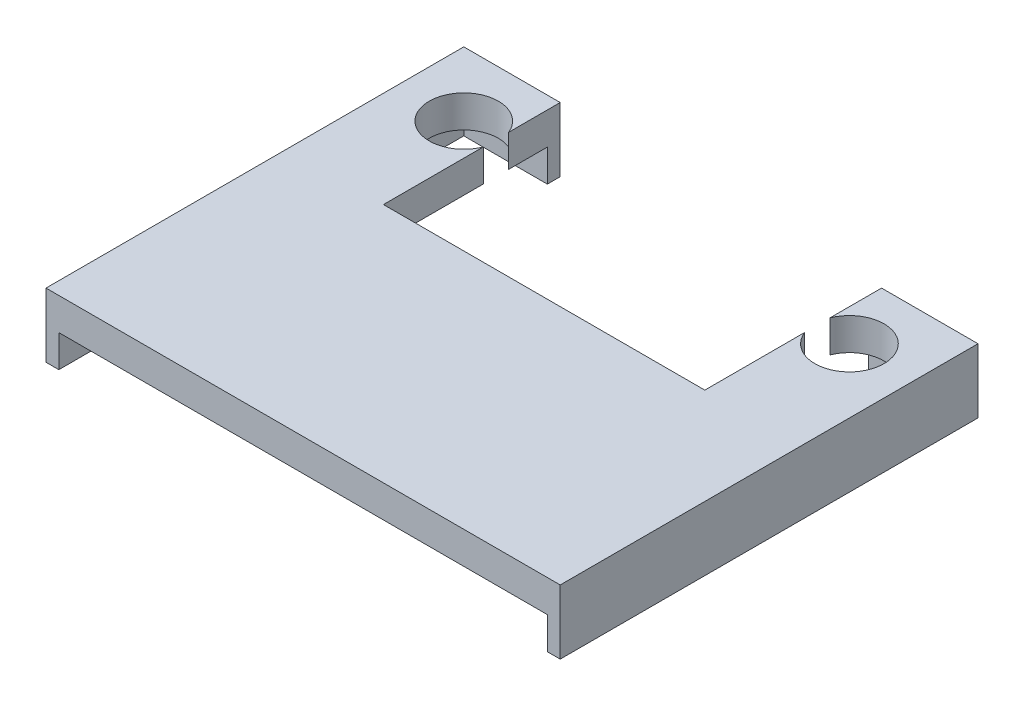
ISO-10303-21;
HEADER;
FILE_DESCRIPTION(('STEP AP214'),'2;1');
FILE_NAME('part.step','',(''),(''),'','','');
FILE_SCHEMA(('AUTOMOTIVE_DESIGN { 1 0 10303 214 1 1 1 1 }'));
ENDSEC;
DATA;
#1=APPLICATION_CONTEXT('core data for automotive mechanical design processes');
#2=APPLICATION_PROTOCOL_DEFINITION('international standard','automotive_design',2000,#1);
#3=PRODUCT_CONTEXT('',#1,'mechanical');
#4=PRODUCT('Part','Part','',(#3));
#5=PRODUCT_RELATED_PRODUCT_CATEGORY('part','',(#4));
#6=PRODUCT_DEFINITION_FORMATION('','',#4);
#7=PRODUCT_DEFINITION_CONTEXT('part definition',#1,'design');
#8=PRODUCT_DEFINITION('design','',#6,#7);
#9=PRODUCT_DEFINITION_SHAPE('','',#8);
#10=(LENGTH_UNIT() NAMED_UNIT(*) SI_UNIT(.MILLI.,.METRE.));
#11=(NAMED_UNIT(*) PLANE_ANGLE_UNIT() SI_UNIT($,.RADIAN.));
#12=(NAMED_UNIT(*) SI_UNIT($,.STERADIAN.) SOLID_ANGLE_UNIT());
#13=UNCERTAINTY_MEASURE_WITH_UNIT(LENGTH_MEASURE(1.E-05),#10,'distance_accuracy_value','');
#14=(GEOMETRIC_REPRESENTATION_CONTEXT(3) GLOBAL_UNCERTAINTY_ASSIGNED_CONTEXT((#13)) GLOBAL_UNIT_ASSIGNED_CONTEXT((#10,
#11,#12)) REPRESENTATION_CONTEXT('',''));
#15=CARTESIAN_POINT('',(0.,0.,0.));
#16=DIRECTION('',(0.,0.,1.));
#17=DIRECTION('',(1.,0.,0.));
#18=AXIS2_PLACEMENT_3D('',#15,#16,#17);
#19=CARTESIAN_POINT('',(0.,6.39522910088368,-0.340843123663283));
#20=DIRECTION('',(0.,1.,0.));
#21=DIRECTION('',(0.,0.,1.));
#22=AXIS2_PLACEMENT_3D('',#19,#20,#21);
#23=PLANE('',#22);
#24=DIRECTION('',(0.,0.,-1.));
#25=VECTOR('',#24,1.);
#26=CARTESIAN_POINT('',(-2.5,6.39522910088368,-2.34084312366329));
#27=LINE('',#26,#25);
#28=CARTESIAN_POINT('',(-2.5,6.39522910088368,-4.14084312366328));
#29=VERTEX_POINT('',#28);
#30=CARTESIAN_POINT('',(-2.5,6.39522910088368,-4.34084312366328));
#31=VERTEX_POINT('',#30);
#32=EDGE_CURVE('E294',#29,#31,#27,.T.);
#33=ORIENTED_EDGE('',*,*,#32,.F.);
#34=DIRECTION('',(1.,0.,0.));
#35=VECTOR('',#34,1.);
#36=CARTESIAN_POINT('',(0.,6.39522910088368,-4.14084312366328));
#37=LINE('',#36,#35);
#38=CARTESIAN_POINT('',(-3.8,6.39522910088368,-4.14084312366328));
#39=VERTEX_POINT('',#38);
#40=EDGE_CURVE('E222',#39,#29,#37,.T.);
#41=ORIENTED_EDGE('',*,*,#40,.F.);
#42=DIRECTION('',(0.,0.,-1.));
#43=VECTOR('',#42,1.);
#44=CARTESIAN_POINT('',(-3.8,6.39522910088368,-0.340843123663283));
#45=LINE('',#44,#43);
#46=CARTESIAN_POINT('',(-3.8,6.39522910088368,2.15915687633672));
#47=VERTEX_POINT('',#46);
#48=EDGE_CURVE('E225',#47,#39,#45,.T.);
#49=ORIENTED_EDGE('',*,*,#48,.F.);
#50=DIRECTION('',(1.,0.,0.));
#51=VECTOR('',#50,1.);
#52=CARTESIAN_POINT('',(0.,6.39522910088368,2.15915687633672));
#53=LINE('',#52,#51);
#54=CARTESIAN_POINT('',(-4.,6.39522910088368,2.15915687633672));
#55=VERTEX_POINT('',#54);
#56=EDGE_CURVE('E282',#55,#47,#53,.T.);
#57=ORIENTED_EDGE('',*,*,#56,.F.);
#58=DIRECTION('',(0.,0.,-1.));
#59=VECTOR('',#58,1.);
#60=CARTESIAN_POINT('',(-4.,6.39522910088368,3.65915687633672));
#61=LINE('',#60,#59);
#62=CARTESIAN_POINT('',(-4.,6.39522910088368,-4.34084312366328));
#63=VERTEX_POINT('',#62);
#64=EDGE_CURVE('E362',#55,#63,#61,.T.);
#65=ORIENTED_EDGE('',*,*,#64,.T.);
#66=DIRECTION('',(1.,0.,0.));
#67=VECTOR('',#66,1.);
#68=CARTESIAN_POINT('',(-4.,6.39522910088368,-4.34084312366328));
#69=LINE('',#68,#67);
#70=EDGE_CURVE('E373',#63,#31,#69,.T.);
#71=ORIENTED_EDGE('',*,*,#70,.T.);
#72=EDGE_LOOP('',(#33,#41,#49,#57,#65,#71));
#73=FACE_BOUND('',#72,.T.);
#74=ADVANCED_FACE('F73',(#73),#23,.F.);
#75=CARTESIAN_POINT('',(-2.5,7.79522910088368,-0.340843123663283));
#76=DIRECTION('',(1.,0.,0.));
#77=DIRECTION('',(0.,0.,-1.));
#78=AXIS2_PLACEMENT_3D('',#75,#76,#77);
#79=PLANE('',#78);
#80=DIRECTION('',(0.,-1.,0.));
#81=VECTOR('',#80,1.);
#82=CARTESIAN_POINT('',(-2.5,7.79522910088368,-1.59084312366329));
#83=LINE('',#82,#81);
#84=CARTESIAN_POINT('',(-2.5,7.39522910088368,-1.59084312366329));
#85=VERTEX_POINT('',#84);
#86=CARTESIAN_POINT('',(-2.5,6.89522910088368,-1.59084312366329));
#87=VERTEX_POINT('',#86);
#88=EDGE_CURVE('E299',#85,#87,#83,.T.);
#89=ORIENTED_EDGE('',*,*,#88,.T.);
#90=DIRECTION('',(0.,0.,1.));
#91=VECTOR('',#90,1.);
#92=CARTESIAN_POINT('',(-2.5,6.89522910088368,-0.340843123663283));
#93=LINE('',#92,#91);
#94=CARTESIAN_POINT('',(-2.5,6.89522910088368,-3.14369754251741));
#95=VERTEX_POINT('',#94);
#96=EDGE_CURVE('E244',#95,#87,#93,.T.);
#97=ORIENTED_EDGE('',*,*,#96,.F.);
#98=DIRECTION('',(0.,-1.,0.));
#99=VECTOR('',#98,1.);
#100=CARTESIAN_POINT('',(-2.5,7.79522910088368,-3.14369754251741));
#101=LINE('',#100,#99);
#102=CARTESIAN_POINT('',(-2.5,7.39522910088368,-3.14369754251741));
#103=VERTEX_POINT('',#102);
#104=EDGE_CURVE('E315',#103,#95,#101,.T.);
#105=ORIENTED_EDGE('',*,*,#104,.F.);
#106=DIRECTION('',(0.,0.,-1.));
#107=VECTOR('',#106,1.);
#108=CARTESIAN_POINT('',(-2.5,7.39522910088368,-0.340843123663283));
#109=LINE('',#108,#107);
#110=EDGE_CURVE('E353',#85,#103,#109,.T.);
#111=ORIENTED_EDGE('',*,*,#110,.F.);
#112=EDGE_LOOP('',(#89,#97,#105,#111));
#113=FACE_BOUND('',#112,.T.);
#114=ADVANCED_FACE('F412',(#113),#79,.T.);
#115=CARTESIAN_POINT('',(0.,7.79522910088368,-1.59084312366329));
#116=DIRECTION('',(0.,0.,-1.));
#117=DIRECTION('',(-1.,0.,0.));
#118=AXIS2_PLACEMENT_3D('',#115,#116,#117);
#119=PLANE('',#118);
#120=DIRECTION('',(0.,-1.,0.));
#121=VECTOR('',#120,1.);
#122=CARTESIAN_POINT('',(2.5,7.79522910088368,-1.59084312366329));
#123=LINE('',#122,#121);
#124=CARTESIAN_POINT('',(2.5,7.39522910088368,-1.59084312366329));
#125=VERTEX_POINT('',#124);
#126=CARTESIAN_POINT('',(2.5,6.89522910088368,-1.59084312366329));
#127=VERTEX_POINT('',#126);
#128=EDGE_CURVE('E295',#125,#127,#123,.T.);
#129=ORIENTED_EDGE('',*,*,#128,.T.);
#130=DIRECTION('',(1.,0.,0.));
#131=VECTOR('',#130,1.);
#132=CARTESIAN_POINT('',(0.,6.89522910088368,-1.59084312366329));
#133=LINE('',#132,#131);
#134=EDGE_CURVE('E247',#87,#127,#133,.T.);
#135=ORIENTED_EDGE('',*,*,#134,.F.);
#136=ORIENTED_EDGE('',*,*,#88,.F.);
#137=DIRECTION('',(-1.,0.,0.));
#138=VECTOR('',#137,1.);
#139=CARTESIAN_POINT('',(0.,7.39522910088368,-1.59084312366329));
#140=LINE('',#139,#138);
#141=EDGE_CURVE('E349',#125,#85,#140,.T.);
#142=ORIENTED_EDGE('',*,*,#141,.F.);
#143=EDGE_LOOP('',(#129,#135,#136,#142));
#144=FACE_BOUND('',#143,.T.);
#145=ADVANCED_FACE('F415',(#144),#119,.T.);
#146=CARTESIAN_POINT('',(2.5,7.79522910088368,-0.340843123663283));
#147=DIRECTION('',(1.,0.,0.));
#148=DIRECTION('',(0.,0.,-1.));
#149=AXIS2_PLACEMENT_3D('',#146,#147,#148);
#150=PLANE('',#149);
#151=DIRECTION('',(0.,0.,-1.));
#152=VECTOR('',#151,1.);
#153=CARTESIAN_POINT('',(2.5,6.89522910088368,-0.340843123663283));
#154=LINE('',#153,#152);
#155=CARTESIAN_POINT('',(2.5,6.89522910088368,-3.14369754251741));
#156=VERTEX_POINT('',#155);
#157=EDGE_CURVE('E250',#127,#156,#154,.T.);
#158=ORIENTED_EDGE('',*,*,#157,.F.);
#159=ORIENTED_EDGE('',*,*,#128,.F.);
#160=DIRECTION('',(0.,0.,-1.));
#161=VECTOR('',#160,1.);
#162=CARTESIAN_POINT('',(2.5,7.39522910088368,-0.340843123663283));
#163=LINE('',#162,#161);
#164=CARTESIAN_POINT('',(2.5,7.39522910088368,-3.14369754251741));
#165=VERTEX_POINT('',#164);
#166=EDGE_CURVE('E346',#125,#165,#163,.T.);
#167=ORIENTED_EDGE('',*,*,#166,.T.);
#168=DIRECTION('',(0.,-1.,0.));
#169=VECTOR('',#168,1.);
#170=CARTESIAN_POINT('',(2.5,7.79522910088368,-3.14369754251741));
#171=LINE('',#170,#169);
#172=EDGE_CURVE('E325',#165,#156,#171,.T.);
#173=ORIENTED_EDGE('',*,*,#172,.T.);
#174=EDGE_LOOP('',(#158,#159,#167,#173));
#175=FACE_BOUND('',#174,.T.);
#176=ADVANCED_FACE('F425',(#175),#150,.F.);
#177=CARTESIAN_POINT('',(-3.,7.79522910088368,-3.34084312366328));
#178=DIRECTION('',(0.,-1.,0.));
#179=DIRECTION('',(0.,0.,-1.));
#180=AXIS2_PLACEMENT_3D('',#177,#178,#179);
#181=CYLINDRICAL_SURFACE('',#180,0.537462910502059);
#182=ORIENTED_EDGE('',*,*,#104,.T.);
#183=CARTESIAN_POINT('',(-3.,6.89522910088368,-3.34084312366328));
#184=DIRECTION('',(0.,-1.,0.));
#185=DIRECTION('',(0.,0.,-1.));
#186=AXIS2_PLACEMENT_3D('',#183,#184,#185);
#187=CIRCLE('',#186,0.537462910502059);
#188=CARTESIAN_POINT('',(-2.5,6.89522910088368,-3.53798870480916));
#189=VERTEX_POINT('',#188);
#190=EDGE_CURVE('E241',#189,#95,#187,.F.);
#191=ORIENTED_EDGE('',*,*,#190,.F.);
#192=DIRECTION('',(0.,-1.,0.));
#193=VECTOR('',#192,1.);
#194=CARTESIAN_POINT('',(-2.5,7.79522910088368,-3.53798870480916));
#195=LINE('',#194,#193);
#196=CARTESIAN_POINT('',(-2.5,7.39522910088368,-3.53798870480916));
#197=VERTEX_POINT('',#196);
#198=EDGE_CURVE('E322',#189,#197,#195,.F.);
#199=ORIENTED_EDGE('',*,*,#198,.T.);
#200=CARTESIAN_POINT('',(-3.,7.39522910088368,-3.34084312366328));
#201=DIRECTION('',(0.,1.,0.));
#202=DIRECTION('',(0.,0.,1.));
#203=AXIS2_PLACEMENT_3D('',#200,#201,#202);
#204=CIRCLE('',#203,0.537462910502059);
#205=EDGE_CURVE('E342',#103,#197,#204,.F.);
#206=ORIENTED_EDGE('',*,*,#205,.F.);
#207=EDGE_LOOP('',(#182,#191,#199,#206));
#208=FACE_BOUND('',#207,.T.);
#209=ADVANCED_FACE('F407',(#208),#181,.F.);
#210=CARTESIAN_POINT('',(3.00000000000001,7.79522910088368,-3.34084312366328));
#211=DIRECTION('',(0.,-1.,0.));
#212=DIRECTION('',(0.,0.,-1.));
#213=AXIS2_PLACEMENT_3D('',#210,#211,#212);
#214=CYLINDRICAL_SURFACE('',#213,0.537462910502059);
#215=CARTESIAN_POINT('',(3.00000000000001,6.89522910088368,-3.34084312366328));
#216=DIRECTION('',(0.,-1.,0.));
#217=DIRECTION('',(0.,0.,-1.));
#218=AXIS2_PLACEMENT_3D('',#215,#216,#217);
#219=CIRCLE('',#218,0.537462910502059);
#220=CARTESIAN_POINT('',(2.5,6.89522910088368,-3.53798870480916));
#221=VERTEX_POINT('',#220);
#222=EDGE_CURVE('E253',#156,#221,#219,.F.);
#223=ORIENTED_EDGE('',*,*,#222,.F.);
#224=ORIENTED_EDGE('',*,*,#172,.F.);
#225=CARTESIAN_POINT('',(3.00000000000001,7.39522910088368,-3.34084312366328));
#226=DIRECTION('',(0.,1.,0.));
#227=DIRECTION('',(0.,0.,1.));
#228=AXIS2_PLACEMENT_3D('',#225,#226,#227);
#229=CIRCLE('',#228,0.537462910502059);
#230=CARTESIAN_POINT('',(2.5,7.39522910088368,-3.53798870480916));
#231=VERTEX_POINT('',#230);
#232=EDGE_CURVE('E304',#165,#231,#229,.T.);
#233=ORIENTED_EDGE('',*,*,#232,.T.);
#234=DIRECTION('',(0.,-1.,0.));
#235=VECTOR('',#234,1.);
#236=CARTESIAN_POINT('',(2.5,7.79522910088368,-3.53798870480916));
#237=LINE('',#236,#235);
#238=EDGE_CURVE('E300',#221,#231,#237,.F.);
#239=ORIENTED_EDGE('',*,*,#238,.F.);
#240=EDGE_LOOP('',(#223,#224,#233,#239));
#241=FACE_BOUND('',#240,.T.);
#242=ADVANCED_FACE('F428',(#241),#214,.F.);
#243=CARTESIAN_POINT('',(-4.,7.39522910088368,-4.34084312366328));
#244=DIRECTION('',(0.,0.,-1.));
#245=DIRECTION('',(-1.,0.,0.));
#246=AXIS2_PLACEMENT_3D('',#243,#244,#245);
#247=PLANE('',#246);
#248=CARTESIAN_POINT('',(2.5,6.39522910088368,-4.34084312366328));
#249=VERTEX_POINT('',#248);
#250=CARTESIAN_POINT('',(4.00000000000001,6.39522910088368,-4.34084312366328));
#251=VERTEX_POINT('',#250);
#252=EDGE_CURVE('E372',#249,#251,#69,.T.);
#253=ORIENTED_EDGE('',*,*,#252,.F.);
#254=DIRECTION('',(0.,-1.,0.));
#255=VECTOR('',#254,1.);
#256=CARTESIAN_POINT('',(2.5,7.79522910088368,-4.34084312366328));
#257=LINE('',#256,#255);
#258=CARTESIAN_POINT('',(2.5,7.39522910088368,-4.34084312366328));
#259=VERTEX_POINT('',#258);
#260=EDGE_CURVE('E311',#259,#249,#257,.T.);
#261=ORIENTED_EDGE('',*,*,#260,.F.);
#262=DIRECTION('',(1.,0.,0.));
#263=VECTOR('',#262,1.);
#264=CARTESIAN_POINT('',(-4.,7.39522910088368,-4.34084312366328));
#265=LINE('',#264,#263);
#266=CARTESIAN_POINT('',(4.00000000000001,7.39522910088368,-4.34084312366328));
#267=VERTEX_POINT('',#266);
#268=EDGE_CURVE('E361',#259,#267,#265,.T.);
#269=ORIENTED_EDGE('',*,*,#268,.T.);
#270=DIRECTION('',(0.,-1.,0.));
#271=VECTOR('',#270,1.);
#272=CARTESIAN_POINT('',(4.00000000000001,7.39522910088368,-4.34084312366328));
#273=LINE('',#272,#271);
#274=EDGE_CURVE('E12',#267,#251,#273,.T.);
#275=ORIENTED_EDGE('',*,*,#274,.T.);
#276=EDGE_LOOP('',(#253,#261,#269,#275));
#277=FACE_BOUND('',#276,.T.);
#278=ADVANCED_FACE('F447',(#277),#247,.T.);
#279=CARTESIAN_POINT('',(4.00000000000001,7.39522910088368,3.65915687633672));
#280=DIRECTION('',(-1.,0.,0.));
#281=DIRECTION('',(0.,0.,1.));
#282=AXIS2_PLACEMENT_3D('',#279,#280,#281);
#283=PLANE('',#282);
#284=DIRECTION('',(0.,0.,-1.));
#285=VECTOR('',#284,1.);
#286=CARTESIAN_POINT('',(4.00000000000001,7.39522910088368,3.65915687633672));
#287=LINE('',#286,#285);
#288=CARTESIAN_POINT('',(4.00000000000001,7.39522910088368,2.15915687633672));
#289=VERTEX_POINT('',#288);
#290=EDGE_CURVE('E358',#289,#267,#287,.T.);
#291=ORIENTED_EDGE('',*,*,#290,.F.);
#292=DIRECTION('',(0.,-1.,0.));
#293=VECTOR('',#292,1.);
#294=CARTESIAN_POINT('',(4.00000000000001,7.79522910088368,2.15915687633672));
#295=LINE('',#294,#293);
#296=CARTESIAN_POINT('',(4.00000000000001,6.39522910088368,2.15915687633672));
#297=VERTEX_POINT('',#296);
#298=EDGE_CURVE('E285',#289,#297,#295,.T.);
#299=ORIENTED_EDGE('',*,*,#298,.T.);
#300=DIRECTION('',(0.,0.,-1.));
#301=VECTOR('',#300,1.);
#302=CARTESIAN_POINT('',(4.00000000000001,6.39522910088368,3.65915687633672));
#303=LINE('',#302,#301);
#304=EDGE_CURVE('E357',#297,#251,#303,.T.);
#305=ORIENTED_EDGE('',*,*,#304,.T.);
#306=ORIENTED_EDGE('',*,*,#274,.F.);
#307=EDGE_LOOP('',(#291,#299,#305,#306));
#308=FACE_BOUND('',#307,.T.);
#309=ADVANCED_FACE('F75',(#308),#283,.F.);
#310=DIRECTION('',(0.,-1.,0.));
#311=VECTOR('',#310,1.);
#312=CARTESIAN_POINT('',(-2.5,7.79522910088368,-4.34084312366328));
#313=LINE('',#312,#311);
#314=CARTESIAN_POINT('',(-2.5,7.39522910088368,-4.34084312366328));
#315=VERTEX_POINT('',#314);
#316=EDGE_CURVE('E310',#315,#31,#313,.T.);
#317=ORIENTED_EDGE('',*,*,#316,.T.);
#318=ORIENTED_EDGE('',*,*,#70,.F.);
#319=DIRECTION('',(0.,-1.,0.));
#320=VECTOR('',#319,1.);
#321=CARTESIAN_POINT('',(-4.,7.39522910088368,-4.34084312366328));
#322=LINE('',#321,#320);
#323=CARTESIAN_POINT('',(-4.,7.39522910088368,-4.34084312366328));
#324=VERTEX_POINT('',#323);
#325=EDGE_CURVE('E82',#324,#63,#322,.T.);
#326=ORIENTED_EDGE('',*,*,#325,.F.);
#327=EDGE_CURVE('E363',#324,#315,#265,.T.);
#328=ORIENTED_EDGE('',*,*,#327,.T.);
#329=EDGE_LOOP('',(#317,#318,#326,#328));
#330=FACE_BOUND('',#329,.T.);
#331=ADVANCED_FACE('F388',(#330),#247,.T.);
#332=CARTESIAN_POINT('',(-4.,7.39522910088368,3.65915687633672));
#333=DIRECTION('',(-1.,0.,0.));
#334=DIRECTION('',(0.,0.,1.));
#335=AXIS2_PLACEMENT_3D('',#332,#333,#334);
#336=PLANE('',#335);
#337=DIRECTION('',(0.,-1.,0.));
#338=VECTOR('',#337,1.);
#339=CARTESIAN_POINT('',(-4.,7.79522910088368,2.15915687633672));
#340=LINE('',#339,#338);
#341=CARTESIAN_POINT('',(-4.,7.39522910088368,2.15915687633672));
#342=VERTEX_POINT('',#341);
#343=EDGE_CURVE('E97',#342,#55,#340,.T.);
#344=ORIENTED_EDGE('',*,*,#343,.F.);
#345=DIRECTION('',(0.,0.,-1.));
#346=VECTOR('',#345,1.);
#347=CARTESIAN_POINT('',(-4.,7.39522910088368,3.65915687633672));
#348=LINE('',#347,#346);
#349=EDGE_CURVE('E367',#342,#324,#348,.T.);
#350=ORIENTED_EDGE('',*,*,#349,.T.);
#351=ORIENTED_EDGE('',*,*,#325,.T.);
#352=ORIENTED_EDGE('',*,*,#64,.F.);
#353=EDGE_LOOP('',(#344,#350,#351,#352));
#354=FACE_BOUND('',#353,.T.);
#355=ADVANCED_FACE('F384',(#354),#336,.T.);
#356=CARTESIAN_POINT('',(0.,7.39522910088368,-0.340843123663283));
#357=DIRECTION('',(0.,1.,0.));
#358=DIRECTION('',(0.,0.,1.));
#359=AXIS2_PLACEMENT_3D('',#356,#357,#358);
#360=PLANE('',#359);
#361=DIRECTION('',(-1.,0.,0.));
#362=VECTOR('',#361,1.);
#363=CARTESIAN_POINT('',(0.,7.39522910088368,2.15915687633672));
#364=LINE('',#363,#362);
#365=EDGE_CURVE('E289',#289,#342,#364,.T.);
#366=ORIENTED_EDGE('',*,*,#365,.F.);
#367=ORIENTED_EDGE('',*,*,#290,.T.);
#368=ORIENTED_EDGE('',*,*,#268,.F.);
#369=DIRECTION('',(0.,0.,1.));
#370=VECTOR('',#369,1.);
#371=CARTESIAN_POINT('',(2.5,7.39522910088368,-0.340843123663283));
#372=LINE('',#371,#370);
#373=EDGE_CURVE('E334',#259,#231,#372,.T.);
#374=ORIENTED_EDGE('',*,*,#373,.T.);
#375=ORIENTED_EDGE('',*,*,#232,.F.);
#376=ORIENTED_EDGE('',*,*,#166,.F.);
#377=ORIENTED_EDGE('',*,*,#141,.T.);
#378=ORIENTED_EDGE('',*,*,#110,.T.);
#379=ORIENTED_EDGE('',*,*,#205,.T.);
#380=DIRECTION('',(0.,0.,1.));
#381=VECTOR('',#380,1.);
#382=CARTESIAN_POINT('',(-2.5,7.39522910088368,-0.340843123663283));
#383=LINE('',#382,#381);
#384=EDGE_CURVE('E338',#315,#197,#383,.T.);
#385=ORIENTED_EDGE('',*,*,#384,.F.);
#386=ORIENTED_EDGE('',*,*,#327,.F.);
#387=ORIENTED_EDGE('',*,*,#349,.F.);
#388=EDGE_LOOP('',(#366,#367,#368,#374,#375,#376,#377,#378,#379,#385,#386,#387));
#389=FACE_BOUND('',#388,.T.);
#390=ADVANCED_FACE('F420',(#389),#360,.T.);
#391=DIRECTION('',(0.,0.,1.));
#392=VECTOR('',#391,1.);
#393=CARTESIAN_POINT('',(3.8,6.39522910088368,-0.340843123663283));
#394=LINE('',#393,#392);
#395=CARTESIAN_POINT('',(3.8,6.39522910088368,-4.14084312366328));
#396=VERTEX_POINT('',#395);
#397=CARTESIAN_POINT('',(3.8,6.39522910088368,2.15915687633672));
#398=VERTEX_POINT('',#397);
#399=EDGE_CURVE('E260',#396,#398,#394,.T.);
#400=ORIENTED_EDGE('',*,*,#399,.F.);
#401=DIRECTION('',(1.,0.,0.));
#402=VECTOR('',#401,1.);
#403=CARTESIAN_POINT('',(0.,6.39522910088368,-4.14084312366328));
#404=LINE('',#403,#402);
#405=CARTESIAN_POINT('',(2.5,6.39522910088368,-4.14084312366328));
#406=VERTEX_POINT('',#405);
#407=EDGE_CURVE('E205',#406,#396,#404,.T.);
#408=ORIENTED_EDGE('',*,*,#407,.F.);
#409=DIRECTION('',(0.,0.,-1.));
#410=VECTOR('',#409,1.);
#411=CARTESIAN_POINT('',(2.5,6.39522910088368,-2.34084312366329));
#412=LINE('',#411,#410);
#413=EDGE_CURVE('E307',#406,#249,#412,.T.);
#414=ORIENTED_EDGE('',*,*,#413,.T.);
#415=ORIENTED_EDGE('',*,*,#252,.T.);
#416=ORIENTED_EDGE('',*,*,#304,.F.);
#417=EDGE_CURVE('E269',#398,#297,#53,.T.);
#418=ORIENTED_EDGE('',*,*,#417,.F.);
#419=EDGE_LOOP('',(#400,#408,#414,#415,#416,#418));
#420=FACE_BOUND('',#419,.T.);
#421=ADVANCED_FACE('F434',(#420),#23,.F.);
#422=CARTESIAN_POINT('',(-2.5,7.79522910088368,-2.34084312366329));
#423=DIRECTION('',(-1.,0.,0.));
#424=DIRECTION('',(0.,0.,1.));
#425=AXIS2_PLACEMENT_3D('',#422,#423,#424);
#426=PLANE('',#425);
#427=DIRECTION('',(0.,0.,1.));
#428=VECTOR('',#427,1.);
#429=CARTESIAN_POINT('',(-2.5,6.89522910088368,-0.340843123663283));
#430=LINE('',#429,#428);
#431=CARTESIAN_POINT('',(-2.5,6.89522910088368,-4.14084312366328));
#432=VERTEX_POINT('',#431);
#433=EDGE_CURVE('E238',#432,#189,#430,.T.);
#434=ORIENTED_EDGE('',*,*,#433,.F.);
#435=DIRECTION('',(0.,-1.,0.));
#436=VECTOR('',#435,1.);
#437=CARTESIAN_POINT('',(-2.5,6.89522910088368,-4.14084312366328));
#438=LINE('',#437,#436);
#439=EDGE_CURVE('E270',#432,#29,#438,.T.);
#440=ORIENTED_EDGE('',*,*,#439,.T.);
#441=ORIENTED_EDGE('',*,*,#32,.T.);
#442=ORIENTED_EDGE('',*,*,#316,.F.);
#443=ORIENTED_EDGE('',*,*,#384,.T.);
#444=ORIENTED_EDGE('',*,*,#198,.F.);
#445=EDGE_LOOP('',(#434,#440,#441,#442,#443,#444));
#446=FACE_BOUND('',#445,.T.);
#447=ADVANCED_FACE('F404',(#446),#426,.F.);
#448=CARTESIAN_POINT('',(2.5,7.79522910088368,-2.34084312366329));
#449=DIRECTION('',(-1.,0.,0.));
#450=DIRECTION('',(0.,0.,1.));
#451=AXIS2_PLACEMENT_3D('',#448,#449,#450);
#452=PLANE('',#451);
#453=DIRECTION('',(0.,-1.,0.));
#454=VECTOR('',#453,1.);
#455=CARTESIAN_POINT('',(2.5,6.89522910088368,-4.14084312366328));
#456=LINE('',#455,#454);
#457=CARTESIAN_POINT('',(2.5,6.89522910088368,-4.14084312366328));
#458=VERTEX_POINT('',#457);
#459=EDGE_CURVE('E266',#458,#406,#456,.T.);
#460=ORIENTED_EDGE('',*,*,#459,.F.);
#461=DIRECTION('',(0.,0.,-1.));
#462=VECTOR('',#461,1.);
#463=CARTESIAN_POINT('',(2.5,6.89522910088368,-0.340843123663283));
#464=LINE('',#463,#462);
#465=EDGE_CURVE('E210',#221,#458,#464,.T.);
#466=ORIENTED_EDGE('',*,*,#465,.F.);
#467=ORIENTED_EDGE('',*,*,#238,.T.);
#468=ORIENTED_EDGE('',*,*,#373,.F.);
#469=ORIENTED_EDGE('',*,*,#260,.T.);
#470=ORIENTED_EDGE('',*,*,#413,.F.);
#471=EDGE_LOOP('',(#460,#466,#467,#468,#469,#470));
#472=FACE_BOUND('',#471,.T.);
#473=ADVANCED_FACE('F431',(#472),#452,.T.);
#474=CARTESIAN_POINT('',(0.,7.79522910088368,2.15915687633672));
#475=DIRECTION('',(0.,0.,-1.));
#476=DIRECTION('',(-1.,0.,0.));
#477=AXIS2_PLACEMENT_3D('',#474,#475,#476);
#478=PLANE('',#477);
#479=ORIENTED_EDGE('',*,*,#56,.T.);
#480=DIRECTION('',(0.,-1.,0.));
#481=VECTOR('',#480,1.);
#482=CARTESIAN_POINT('',(-3.8,6.89522910088368,2.15915687633672));
#483=LINE('',#482,#481);
#484=CARTESIAN_POINT('',(-3.8,6.89522910088368,2.15915687633672));
#485=VERTEX_POINT('',#484);
#486=EDGE_CURVE('E277',#485,#47,#483,.T.);
#487=ORIENTED_EDGE('',*,*,#486,.F.);
#488=DIRECTION('',(1.,0.,0.));
#489=VECTOR('',#488,1.);
#490=CARTESIAN_POINT('',(0.,6.89522910088368,2.15915687633672));
#491=LINE('',#490,#489);
#492=CARTESIAN_POINT('',(3.8,6.89522910088368,2.15915687633672));
#493=VERTEX_POINT('',#492);
#494=EDGE_CURVE('E216',#485,#493,#491,.T.);
#495=ORIENTED_EDGE('',*,*,#494,.T.);
#496=DIRECTION('',(0.,-1.,0.));
#497=VECTOR('',#496,1.);
#498=CARTESIAN_POINT('',(3.8,6.89522910088368,2.15915687633672));
#499=LINE('',#498,#497);
#500=EDGE_CURVE('E209',#493,#398,#499,.T.);
#501=ORIENTED_EDGE('',*,*,#500,.T.);
#502=ORIENTED_EDGE('',*,*,#417,.T.);
#503=ORIENTED_EDGE('',*,*,#298,.F.);
#504=ORIENTED_EDGE('',*,*,#365,.T.);
#505=ORIENTED_EDGE('',*,*,#343,.T.);
#506=EDGE_LOOP('',(#479,#487,#495,#501,#502,#503,#504,#505));
#507=FACE_BOUND('',#506,.T.);
#508=ADVANCED_FACE('F394',(#507),#478,.F.);
#509=CARTESIAN_POINT('',(0.,6.89522910088368,-4.14084312366328));
#510=DIRECTION('',(0.,0.,-1.));
#511=DIRECTION('',(-1.,0.,0.));
#512=AXIS2_PLACEMENT_3D('',#509,#510,#511);
#513=PLANE('',#512);
#514=ORIENTED_EDGE('',*,*,#407,.T.);
#515=DIRECTION('',(0.,-1.,0.));
#516=VECTOR('',#515,1.);
#517=CARTESIAN_POINT('',(3.8,6.89522910088368,-4.14084312366328));
#518=LINE('',#517,#516);
#519=CARTESIAN_POINT('',(3.8,6.89522910088368,-4.14084312366328));
#520=VERTEX_POINT('',#519);
#521=EDGE_CURVE('E200',#520,#396,#518,.T.);
#522=ORIENTED_EDGE('',*,*,#521,.F.);
#523=DIRECTION('',(1.,0.,0.));
#524=VECTOR('',#523,1.);
#525=CARTESIAN_POINT('',(0.,6.89522910088368,-4.14084312366328));
#526=LINE('',#525,#524);
#527=EDGE_CURVE('E202',#458,#520,#526,.T.);
#528=ORIENTED_EDGE('',*,*,#527,.F.);
#529=ORIENTED_EDGE('',*,*,#459,.T.);
#530=EDGE_LOOP('',(#514,#522,#528,#529));
#531=FACE_BOUND('',#530,.T.);
#532=ADVANCED_FACE('F201',(#531),#513,.F.);
#533=CARTESIAN_POINT('',(0.,6.89522910088368,-4.14084312366328));
#534=DIRECTION('',(0.,0.,-1.));
#535=DIRECTION('',(-1.,0.,0.));
#536=AXIS2_PLACEMENT_3D('',#533,#534,#535);
#537=PLANE('',#536);
#538=ORIENTED_EDGE('',*,*,#40,.T.);
#539=ORIENTED_EDGE('',*,*,#439,.F.);
#540=DIRECTION('',(1.,0.,0.));
#541=VECTOR('',#540,1.);
#542=CARTESIAN_POINT('',(0.,6.89522910088368,-4.14084312366328));
#543=LINE('',#542,#541);
#544=CARTESIAN_POINT('',(-3.8,6.89522910088368,-4.14084312366328));
#545=VERTEX_POINT('',#544);
#546=EDGE_CURVE('E234',#545,#432,#543,.T.);
#547=ORIENTED_EDGE('',*,*,#546,.F.);
#548=DIRECTION('',(0.,-1.,0.));
#549=VECTOR('',#548,1.);
#550=CARTESIAN_POINT('',(-3.8,6.89522910088368,-4.14084312366328));
#551=LINE('',#550,#549);
#552=EDGE_CURVE('E274',#545,#39,#551,.T.);
#553=ORIENTED_EDGE('',*,*,#552,.T.);
#554=EDGE_LOOP('',(#538,#539,#547,#553));
#555=FACE_BOUND('',#554,.T.);
#556=ADVANCED_FACE('F490',(#555),#537,.F.);
#557=CARTESIAN_POINT('',(-3.8,6.89522910088368,-0.340843123663283));
#558=DIRECTION('',(-1.,0.,0.));
#559=DIRECTION('',(0.,0.,1.));
#560=AXIS2_PLACEMENT_3D('',#557,#558,#559);
#561=PLANE('',#560);
#562=ORIENTED_EDGE('',*,*,#48,.T.);
#563=ORIENTED_EDGE('',*,*,#552,.F.);
#564=DIRECTION('',(0.,0.,-1.));
#565=VECTOR('',#564,1.);
#566=CARTESIAN_POINT('',(-3.8,6.89522910088368,-0.340843123663283));
#567=LINE('',#566,#565);
#568=EDGE_CURVE('E230',#485,#545,#567,.T.);
#569=ORIENTED_EDGE('',*,*,#568,.F.);
#570=ORIENTED_EDGE('',*,*,#486,.T.);
#571=EDGE_LOOP('',(#562,#563,#569,#570));
#572=FACE_BOUND('',#571,.T.);
#573=ADVANCED_FACE('F397',(#572),#561,.F.);
#574=CARTESIAN_POINT('',(3.8,6.89522910088368,-0.340843123663283));
#575=DIRECTION('',(1.,0.,0.));
#576=DIRECTION('',(0.,0.,-1.));
#577=AXIS2_PLACEMENT_3D('',#574,#575,#576);
#578=PLANE('',#577);
#579=ORIENTED_EDGE('',*,*,#399,.T.);
#580=ORIENTED_EDGE('',*,*,#500,.F.);
#581=DIRECTION('',(0.,0.,1.));
#582=VECTOR('',#581,1.);
#583=CARTESIAN_POINT('',(3.8,6.89522910088368,-0.340843123663283));
#584=LINE('',#583,#582);
#585=EDGE_CURVE('E89',#520,#493,#584,.T.);
#586=ORIENTED_EDGE('',*,*,#585,.F.);
#587=ORIENTED_EDGE('',*,*,#521,.T.);
#588=EDGE_LOOP('',(#579,#580,#586,#587));
#589=FACE_BOUND('',#588,.T.);
#590=ADVANCED_FACE('F212',(#589),#578,.F.);
#591=CARTESIAN_POINT('',(0.,6.89522910088368,-0.340843123663283));
#592=DIRECTION('',(0.,-1.,0.));
#593=DIRECTION('',(0.,0.,-1.));
#594=AXIS2_PLACEMENT_3D('',#591,#592,#593);
#595=PLANE('',#594);
#596=ORIENTED_EDGE('',*,*,#527,.T.);
#597=ORIENTED_EDGE('',*,*,#585,.T.);
#598=ORIENTED_EDGE('',*,*,#494,.F.);
#599=ORIENTED_EDGE('',*,*,#568,.T.);
#600=ORIENTED_EDGE('',*,*,#546,.T.);
#601=ORIENTED_EDGE('',*,*,#433,.T.);
#602=ORIENTED_EDGE('',*,*,#190,.T.);
#603=ORIENTED_EDGE('',*,*,#96,.T.);
#604=ORIENTED_EDGE('',*,*,#134,.T.);
#605=ORIENTED_EDGE('',*,*,#157,.T.);
#606=ORIENTED_EDGE('',*,*,#222,.T.);
#607=ORIENTED_EDGE('',*,*,#465,.T.);
#608=EDGE_LOOP('',(#596,#597,#598,#599,#600,#601,#602,#603,#604,#605,#606,#607));
#609=FACE_BOUND('',#608,.T.);
#610=ADVANCED_FACE('F218',(#609),#595,.T.);
#611=CLOSED_SHELL('',(#74,#114,#145,#176,#209,#242,#278,#309,#331,#355,#390,#421,#447,#473,#508,
#532,#556,#573,#590,#610));
#612=MANIFOLD_SOLID_BREP('B2',#611);
#613=ADVANCED_BREP_SHAPE_REPRESENTATION('',(#18,#612),#14);
#614=SHAPE_DEFINITION_REPRESENTATION(#9,#613);
ENDSEC;
END-ISO-10303-21;
